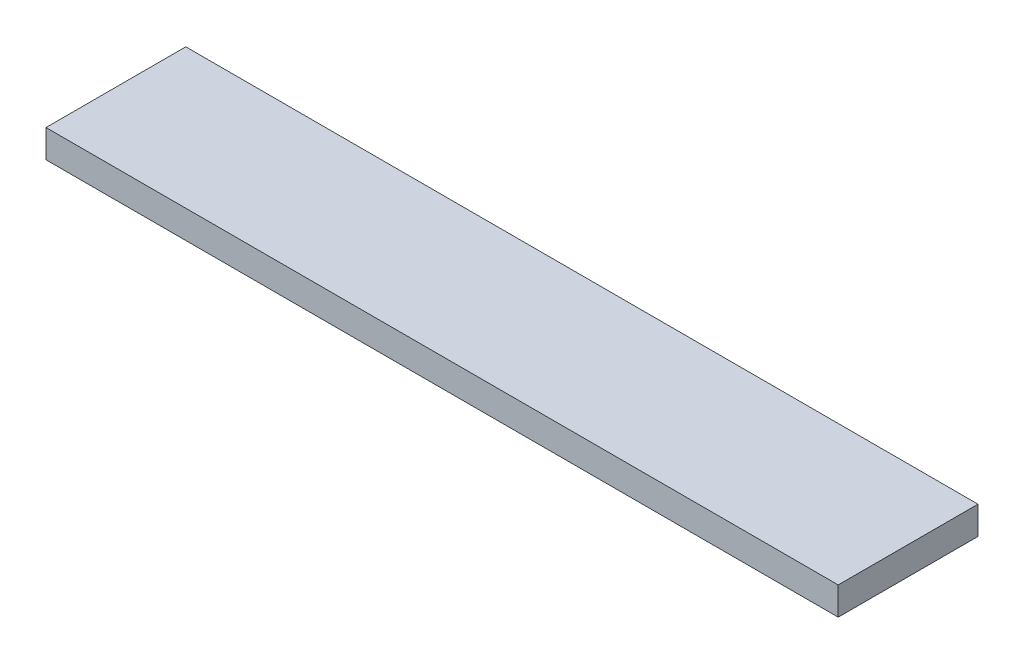
ISO-10303-21;
HEADER;
FILE_DESCRIPTION(('STEP AP214'),'2;1');
FILE_NAME('part.step','',(''),(''),'','','');
FILE_SCHEMA(('AUTOMOTIVE_DESIGN { 1 0 10303 214 1 1 1 1 }'));
ENDSEC;
DATA;
#1=APPLICATION_CONTEXT('core data for automotive mechanical design processes');
#2=APPLICATION_PROTOCOL_DEFINITION('international standard','automotive_design',2000,#1);
#3=PRODUCT_CONTEXT('',#1,'mechanical');
#4=PRODUCT('Part','Part','',(#3));
#5=PRODUCT_RELATED_PRODUCT_CATEGORY('part','',(#4));
#6=PRODUCT_DEFINITION_FORMATION('','',#4);
#7=PRODUCT_DEFINITION_CONTEXT('part definition',#1,'design');
#8=PRODUCT_DEFINITION('design','',#6,#7);
#9=PRODUCT_DEFINITION_SHAPE('','',#8);
#10=(LENGTH_UNIT() NAMED_UNIT(*) SI_UNIT(.MILLI.,.METRE.));
#11=(NAMED_UNIT(*) PLANE_ANGLE_UNIT() SI_UNIT($,.RADIAN.));
#12=(NAMED_UNIT(*) SI_UNIT($,.STERADIAN.) SOLID_ANGLE_UNIT());
#13=UNCERTAINTY_MEASURE_WITH_UNIT(LENGTH_MEASURE(1.E-05),#10,'distance_accuracy_value','');
#14=(GEOMETRIC_REPRESENTATION_CONTEXT(3) GLOBAL_UNCERTAINTY_ASSIGNED_CONTEXT((#13)) GLOBAL_UNIT_ASSIGNED_CONTEXT((#10,
#11,#12)) REPRESENTATION_CONTEXT('',''));
#15=CARTESIAN_POINT('',(0.,0.,0.));
#16=DIRECTION('',(0.,0.,1.));
#17=DIRECTION('',(1.,0.,0.));
#18=AXIS2_PLACEMENT_3D('',#15,#16,#17);
#19=CARTESIAN_POINT('',(170.,12.,30.));
#20=DIRECTION('',(-1.,0.,0.));
#21=DIRECTION('',(0.,0.,1.));
#22=AXIS2_PLACEMENT_3D('',#19,#20,#21);
#23=PLANE('',#22);
#24=DIRECTION('',(0.,0.,-1.));
#25=VECTOR('',#24,1.);
#26=CARTESIAN_POINT('',(170.,0.,30.));
#27=LINE('',#26,#25);
#28=CARTESIAN_POINT('',(170.,0.,30.));
#29=VERTEX_POINT('',#28);
#30=CARTESIAN_POINT('',(170.,0.,-30.));
#31=VERTEX_POINT('',#30);
#32=EDGE_CURVE('E96',#29,#31,#27,.T.);
#33=ORIENTED_EDGE('',*,*,#32,.T.);
#34=DIRECTION('',(0.,-1.,0.));
#35=VECTOR('',#34,1.);
#36=CARTESIAN_POINT('',(170.,12.,-30.));
#37=LINE('',#36,#35);
#38=CARTESIAN_POINT('',(170.,12.,-30.));
#39=VERTEX_POINT('',#38);
#40=EDGE_CURVE('E11',#39,#31,#37,.T.);
#41=ORIENTED_EDGE('',*,*,#40,.F.);
#42=DIRECTION('',(0.,0.,-1.));
#43=VECTOR('',#42,1.);
#44=CARTESIAN_POINT('',(170.,12.,30.));
#45=LINE('',#44,#43);
#46=CARTESIAN_POINT('',(170.,12.,30.));
#47=VERTEX_POINT('',#46);
#48=EDGE_CURVE('E84',#47,#39,#45,.T.);
#49=ORIENTED_EDGE('',*,*,#48,.F.);
#50=DIRECTION('',(0.,-1.,0.));
#51=VECTOR('',#50,1.);
#52=CARTESIAN_POINT('',(170.,12.,30.));
#53=LINE('',#52,#51);
#54=EDGE_CURVE('E92',#47,#29,#53,.T.);
#55=ORIENTED_EDGE('',*,*,#54,.T.);
#56=EDGE_LOOP('',(#33,#41,#49,#55));
#57=FACE_BOUND('',#56,.T.);
#58=ADVANCED_FACE('F33',(#57),#23,.F.);
#59=CARTESIAN_POINT('',(-170.,12.,-30.));
#60=DIRECTION('',(0.,0.,1.));
#61=DIRECTION('',(1.,0.,0.));
#62=AXIS2_PLACEMENT_3D('',#59,#60,#61);
#63=PLANE('',#62);
#64=DIRECTION('',(-1.,0.,0.));
#65=VECTOR('',#64,1.);
#66=CARTESIAN_POINT('',(-170.,0.,-30.));
#67=LINE('',#66,#65);
#68=CARTESIAN_POINT('',(-170.,0.,-30.));
#69=VERTEX_POINT('',#68);
#70=EDGE_CURVE('E88',#31,#69,#67,.T.);
#71=ORIENTED_EDGE('',*,*,#70,.T.);
#72=DIRECTION('',(0.,-1.,0.));
#73=VECTOR('',#72,1.);
#74=CARTESIAN_POINT('',(-170.,12.,-30.));
#75=LINE('',#74,#73);
#76=CARTESIAN_POINT('',(-170.,12.,-30.));
#77=VERTEX_POINT('',#76);
#78=EDGE_CURVE('E41',#77,#69,#75,.T.);
#79=ORIENTED_EDGE('',*,*,#78,.F.);
#80=DIRECTION('',(-1.,0.,0.));
#81=VECTOR('',#80,1.);
#82=CARTESIAN_POINT('',(-170.,12.,-30.));
#83=LINE('',#82,#81);
#84=EDGE_CURVE('E79',#39,#77,#83,.T.);
#85=ORIENTED_EDGE('',*,*,#84,.F.);
#86=ORIENTED_EDGE('',*,*,#40,.T.);
#87=EDGE_LOOP('',(#71,#79,#85,#86));
#88=FACE_BOUND('',#87,.T.);
#89=ADVANCED_FACE('F87',(#88),#63,.F.);
#90=CARTESIAN_POINT('',(-170.,12.,30.));
#91=DIRECTION('',(1.,0.,0.));
#92=DIRECTION('',(0.,0.,-1.));
#93=AXIS2_PLACEMENT_3D('',#90,#91,#92);
#94=PLANE('',#93);
#95=DIRECTION('',(0.,0.,1.));
#96=VECTOR('',#95,1.);
#97=CARTESIAN_POINT('',(-170.,0.,30.));
#98=LINE('',#97,#96);
#99=CARTESIAN_POINT('',(-170.,0.,30.));
#100=VERTEX_POINT('',#99);
#101=EDGE_CURVE('E66',#69,#100,#98,.T.);
#102=ORIENTED_EDGE('',*,*,#101,.T.);
#103=DIRECTION('',(0.,-1.,0.));
#104=VECTOR('',#103,1.);
#105=CARTESIAN_POINT('',(-170.,12.,30.));
#106=LINE('',#105,#104);
#107=CARTESIAN_POINT('',(-170.,12.,30.));
#108=VERTEX_POINT('',#107);
#109=EDGE_CURVE('E89',#108,#100,#106,.T.);
#110=ORIENTED_EDGE('',*,*,#109,.F.);
#111=DIRECTION('',(0.,0.,1.));
#112=VECTOR('',#111,1.);
#113=CARTESIAN_POINT('',(-170.,12.,30.));
#114=LINE('',#113,#112);
#115=EDGE_CURVE('E82',#77,#108,#114,.T.);
#116=ORIENTED_EDGE('',*,*,#115,.F.);
#117=ORIENTED_EDGE('',*,*,#78,.T.);
#118=EDGE_LOOP('',(#102,#110,#116,#117));
#119=FACE_BOUND('',#118,.T.);
#120=ADVANCED_FACE('F90',(#119),#94,.F.);
#121=CARTESIAN_POINT('',(-170.,12.,30.));
#122=DIRECTION('',(0.,0.,-1.));
#123=DIRECTION('',(-1.,0.,0.));
#124=AXIS2_PLACEMENT_3D('',#121,#122,#123);
#125=PLANE('',#124);
#126=DIRECTION('',(1.,0.,0.));
#127=VECTOR('',#126,1.);
#128=CARTESIAN_POINT('',(-170.,0.,30.));
#129=LINE('',#128,#127);
#130=EDGE_CURVE('E72',#100,#29,#129,.T.);
#131=ORIENTED_EDGE('',*,*,#130,.T.);
#132=ORIENTED_EDGE('',*,*,#54,.F.);
#133=DIRECTION('',(1.,0.,0.));
#134=VECTOR('',#133,1.);
#135=CARTESIAN_POINT('',(-170.,12.,30.));
#136=LINE('',#135,#134);
#137=EDGE_CURVE('E49',#108,#47,#136,.T.);
#138=ORIENTED_EDGE('',*,*,#137,.F.);
#139=ORIENTED_EDGE('',*,*,#109,.T.);
#140=EDGE_LOOP('',(#131,#132,#138,#139));
#141=FACE_BOUND('',#140,.T.);
#142=ADVANCED_FACE('F103',(#141),#125,.F.);
#143=CARTESIAN_POINT('',(0.,12.,0.));
#144=DIRECTION('',(0.,-1.,0.));
#145=DIRECTION('',(0.,0.,-1.));
#146=AXIS2_PLACEMENT_3D('',#143,#144,#145);
#147=PLANE('',#146);
#148=ORIENTED_EDGE('',*,*,#48,.T.);
#149=ORIENTED_EDGE('',*,*,#84,.T.);
#150=ORIENTED_EDGE('',*,*,#115,.T.);
#151=ORIENTED_EDGE('',*,*,#137,.T.);
#152=EDGE_LOOP('',(#148,#149,#150,#151));
#153=FACE_BOUND('',#152,.T.);
#154=ADVANCED_FACE('F80',(#153),#147,.F.);
#155=CARTESIAN_POINT('',(0.,0.,0.));
#156=DIRECTION('',(0.,-1.,0.));
#157=DIRECTION('',(0.,0.,-1.));
#158=AXIS2_PLACEMENT_3D('',#155,#156,#157);
#159=PLANE('',#158);
#160=ORIENTED_EDGE('',*,*,#32,.F.);
#161=ORIENTED_EDGE('',*,*,#130,.F.);
#162=ORIENTED_EDGE('',*,*,#101,.F.);
#163=ORIENTED_EDGE('',*,*,#70,.F.);
#164=EDGE_LOOP('',(#160,#161,#162,#163));
#165=FACE_BOUND('',#164,.T.);
#166=ADVANCED_FACE('F106',(#165),#159,.T.);
#167=CLOSED_SHELL('',(#58,#89,#120,#142,#154,#166));
#168=MANIFOLD_SOLID_BREP('B2',#167);
#169=ADVANCED_BREP_SHAPE_REPRESENTATION('',(#18,#168),#14);
#170=SHAPE_DEFINITION_REPRESENTATION(#9,#169);
ENDSEC;
END-ISO-10303-21;
